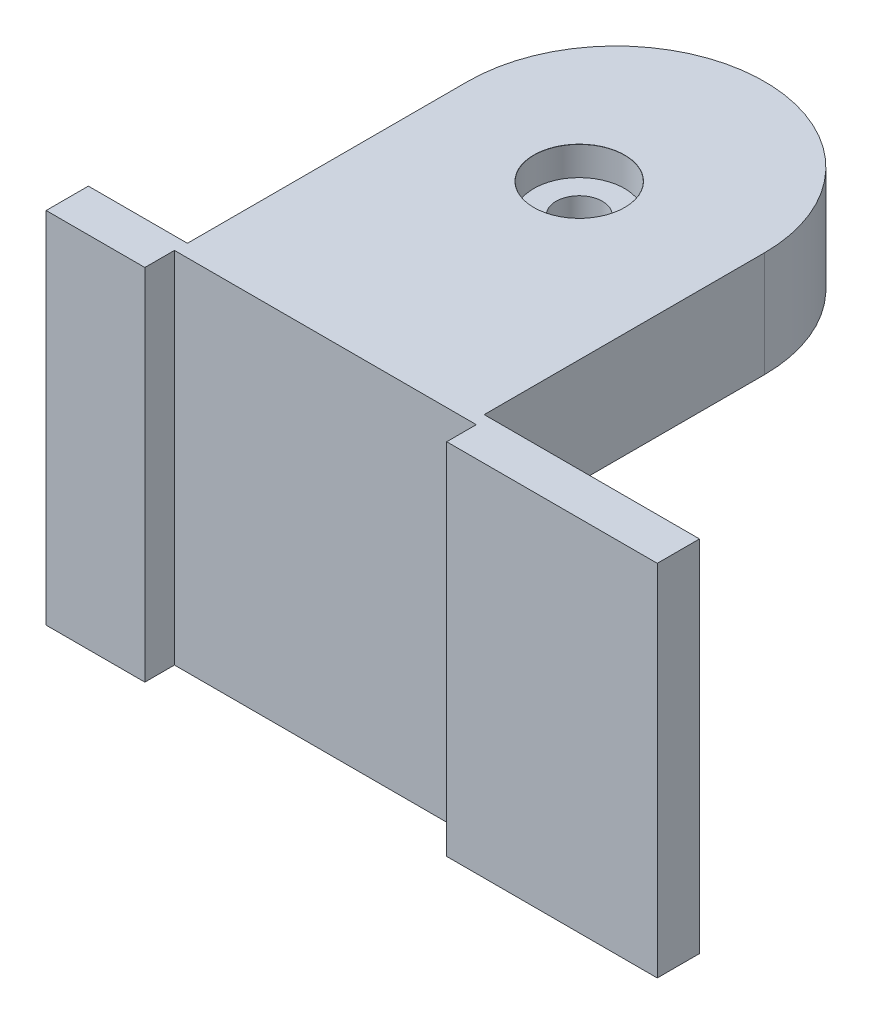
ISO-10303-21;
HEADER;
FILE_DESCRIPTION(('STEP AP214'),'2;1');
FILE_NAME('part.step','',(''),(''),'','','');
FILE_SCHEMA(('AUTOMOTIVE_DESIGN { 1 0 10303 214 1 1 1 1 }'));
ENDSEC;
DATA;
#1=APPLICATION_CONTEXT('core data for automotive mechanical design processes');
#2=APPLICATION_PROTOCOL_DEFINITION('international standard','automotive_design',2000,#1);
#3=PRODUCT_CONTEXT('',#1,'mechanical');
#4=PRODUCT('Part','Part','',(#3));
#5=PRODUCT_RELATED_PRODUCT_CATEGORY('part','',(#4));
#6=PRODUCT_DEFINITION_FORMATION('','',#4);
#7=PRODUCT_DEFINITION_CONTEXT('part definition',#1,'design');
#8=PRODUCT_DEFINITION('design','',#6,#7);
#9=PRODUCT_DEFINITION_SHAPE('','',#8);
#10=(LENGTH_UNIT() NAMED_UNIT(*) SI_UNIT(.MILLI.,.METRE.));
#11=(NAMED_UNIT(*) PLANE_ANGLE_UNIT() SI_UNIT($,.RADIAN.));
#12=(NAMED_UNIT(*) SI_UNIT($,.STERADIAN.) SOLID_ANGLE_UNIT());
#13=UNCERTAINTY_MEASURE_WITH_UNIT(LENGTH_MEASURE(1.E-05),#10,'distance_accuracy_value','');
#14=(GEOMETRIC_REPRESENTATION_CONTEXT(3) GLOBAL_UNCERTAINTY_ASSIGNED_CONTEXT((#13)) GLOBAL_UNIT_ASSIGNED_CONTEXT((#10,
#11,#12)) REPRESENTATION_CONTEXT('',''));
#15=CARTESIAN_POINT('',(0.,0.,0.));
#16=DIRECTION('',(0.,0.,1.));
#17=DIRECTION('',(1.,0.,0.));
#18=AXIS2_PLACEMENT_3D('',#15,#16,#17);
#19=CARTESIAN_POINT('',(0.,0.,4.99999999999997));
#20=DIRECTION('',(0.,0.,1.));
#21=DIRECTION('',(1.,0.,0.));
#22=AXIS2_PLACEMENT_3D('',#19,#20,#21);
#23=PLANE('',#22);
#24=DIRECTION('',(0.,1.,0.));
#25=VECTOR('',#24,1.);
#26=CARTESIAN_POINT('',(-66.2635456404007,-42.3685945886735,4.99999999999997));
#27=LINE('',#26,#25);
#28=CARTESIAN_POINT('',(-66.2635456404007,-42.3685945886735,4.99999999999997));
#29=VERTEX_POINT('',#28);
#30=CARTESIAN_POINT('',(-66.2635456404007,42.6568163205692,4.99999999999997));
#31=VERTEX_POINT('',#30);
#32=EDGE_CURVE('E129',#29,#31,#27,.T.);
#33=ORIENTED_EDGE('',*,*,#32,.T.);
#34=DIRECTION('',(-1.,0.,0.));
#35=VECTOR('',#34,1.);
#36=CARTESIAN_POINT('',(55.0503507920859,42.6568163205692,4.99999999999997));
#37=LINE('',#36,#35);
#38=CARTESIAN_POINT('',(-89.6369586195745,42.6568163205692,4.99999999999997));
#39=VERTEX_POINT('',#38);
#40=EDGE_CURVE('E169',#31,#39,#37,.T.);
#41=ORIENTED_EDGE('',*,*,#40,.T.);
#42=DIRECTION('',(0.,-1.,0.));
#43=VECTOR('',#42,1.);
#44=CARTESIAN_POINT('',(-89.6369586195745,42.6568163205692,4.99999999999997));
#45=LINE('',#44,#43);
#46=CARTESIAN_POINT('',(-89.6369586195745,-42.3685945886735,4.99999999999997));
#47=VERTEX_POINT('',#46);
#48=EDGE_CURVE('E151',#39,#47,#45,.T.);
#49=ORIENTED_EDGE('',*,*,#48,.T.);
#50=DIRECTION('',(-1.,0.,0.));
#51=VECTOR('',#50,1.);
#52=CARTESIAN_POINT('',(55.0503507920859,-42.3685945886735,4.99999999999997));
#53=LINE('',#52,#51);
#54=EDGE_CURVE('E145',#29,#47,#53,.T.);
#55=ORIENTED_EDGE('',*,*,#54,.F.);
#56=EDGE_LOOP('',(#33,#41,#49,#55));
#57=FACE_BOUND('',#56,.T.);
#58=ADVANCED_FACE('F39',(#57),#23,.T.);
#59=CARTESIAN_POINT('',(0.,0.,-4.99999999999997));
#60=DIRECTION('',(0.,0.,1.));
#61=DIRECTION('',(1.,0.,0.));
#62=AXIS2_PLACEMENT_3D('',#59,#60,#61);
#63=PLANE('',#62);
#64=DIRECTION('',(0.,1.,0.));
#65=VECTOR('',#64,1.);
#66=CARTESIAN_POINT('',(-66.1890684352242,17.6568163205692,-4.99999999999997));
#67=LINE('',#66,#65);
#68=CARTESIAN_POINT('',(-66.1890684352242,17.6568163205692,-4.99999999999997));
#69=VERTEX_POINT('',#68);
#70=CARTESIAN_POINT('',(-66.1890684352242,42.6568163205692,-4.99999999999997));
#71=VERTEX_POINT('',#70);
#72=EDGE_CURVE('E184',#69,#71,#67,.T.);
#73=ORIENTED_EDGE('',*,*,#72,.F.);
#74=DIRECTION('',(1.,0.,0.));
#75=VECTOR('',#74,1.);
#76=CARTESIAN_POINT('',(4.07558372386574,17.6568163205692,-4.99999999999998));
#77=LINE('',#76,#75);
#78=CARTESIAN_POINT('',(4.07558372386574,17.6568163205692,-4.99999999999998));
#79=VERTEX_POINT('',#78);
#80=EDGE_CURVE('E223',#69,#79,#77,.T.);
#81=ORIENTED_EDGE('',*,*,#80,.T.);
#82=DIRECTION('',(0.,1.,0.));
#83=VECTOR('',#82,1.);
#84=CARTESIAN_POINT('',(4.07558372386574,17.6568163205692,-4.99999999999998));
#85=LINE('',#84,#83);
#86=CARTESIAN_POINT('',(4.07558372386574,42.6568163205692,-4.99999999999997));
#87=VERTEX_POINT('',#86);
#88=EDGE_CURVE('E165',#79,#87,#85,.T.);
#89=ORIENTED_EDGE('',*,*,#88,.T.);
#90=DIRECTION('',(-1.,0.,0.));
#91=VECTOR('',#90,1.);
#92=CARTESIAN_POINT('',(55.0503507920859,42.6568163205692,-4.99999999999997));
#93=LINE('',#92,#91);
#94=CARTESIAN_POINT('',(55.0503507920859,42.6568163205692,-4.99999999999997));
#95=VERTEX_POINT('',#94);
#96=EDGE_CURVE('E161',#95,#87,#93,.T.);
#97=ORIENTED_EDGE('',*,*,#96,.F.);
#98=DIRECTION('',(0.,-1.,0.));
#99=VECTOR('',#98,1.);
#100=CARTESIAN_POINT('',(55.0503507920859,42.6568163205692,-4.99999999999997));
#101=LINE('',#100,#99);
#102=CARTESIAN_POINT('',(55.0503507920859,-42.3685945886735,-4.99999999999997));
#103=VERTEX_POINT('',#102);
#104=EDGE_CURVE('E155',#95,#103,#101,.T.);
#105=ORIENTED_EDGE('',*,*,#104,.T.);
#106=DIRECTION('',(-1.,0.,0.));
#107=VECTOR('',#106,1.);
#108=CARTESIAN_POINT('',(55.0503507920859,-42.3685945886735,-4.99999999999997));
#109=LINE('',#108,#107);
#110=CARTESIAN_POINT('',(-89.6369586195745,-42.3685945886735,-4.99999999999997));
#111=VERTEX_POINT('',#110);
#112=EDGE_CURVE('E179',#103,#111,#109,.T.);
#113=ORIENTED_EDGE('',*,*,#112,.T.);
#114=DIRECTION('',(0.,-1.,0.));
#115=VECTOR('',#114,1.);
#116=CARTESIAN_POINT('',(-89.6369586195745,42.6568163205692,-4.99999999999997));
#117=LINE('',#116,#115);
#118=CARTESIAN_POINT('',(-89.6369586195745,42.6568163205692,-4.99999999999997));
#119=VERTEX_POINT('',#118);
#120=EDGE_CURVE('E183',#119,#111,#117,.T.);
#121=ORIENTED_EDGE('',*,*,#120,.F.);
#122=EDGE_CURVE('E188',#71,#119,#93,.T.);
#123=ORIENTED_EDGE('',*,*,#122,.F.);
#124=EDGE_LOOP('',(#73,#81,#89,#97,#105,#113,#121,#123));
#125=FACE_BOUND('',#124,.T.);
#126=ADVANCED_FACE('F257',(#125),#63,.F.);
#127=CARTESIAN_POINT('',(55.0503507920859,-42.3685945886735,4.99999999999997));
#128=DIRECTION('',(0.,-1.,0.));
#129=DIRECTION('',(0.,0.,-1.));
#130=AXIS2_PLACEMENT_3D('',#127,#128,#129);
#131=PLANE('',#130);
#132=DIRECTION('',(0.,0.,1.));
#133=VECTOR('',#132,1.);
#134=CARTESIAN_POINT('',(-66.2635456404007,-42.3685945886735,-2.00897527973424));
#135=LINE('',#134,#133);
#136=CARTESIAN_POINT('',(-66.2635456404007,-42.3685945886735,-2.00897527973424));
#137=VERTEX_POINT('',#136);
#138=EDGE_CURVE('E133',#137,#29,#135,.T.);
#139=ORIENTED_EDGE('',*,*,#138,.T.);
#140=ORIENTED_EDGE('',*,*,#54,.T.);
#141=DIRECTION('',(0.,0.,-1.));
#142=VECTOR('',#141,1.);
#143=CARTESIAN_POINT('',(-89.6369586195745,-42.3685945886735,4.99999999999997));
#144=LINE('',#143,#142);
#145=EDGE_CURVE('E178',#47,#111,#144,.T.);
#146=ORIENTED_EDGE('',*,*,#145,.T.);
#147=ORIENTED_EDGE('',*,*,#112,.F.);
#148=DIRECTION('',(0.,0.,-1.));
#149=VECTOR('',#148,1.);
#150=CARTESIAN_POINT('',(55.0503507920859,-42.3685945886735,4.99999999999997));
#151=LINE('',#150,#149);
#152=CARTESIAN_POINT('',(55.0503507920859,-42.3685945886735,4.99999999999997));
#153=VERTEX_POINT('',#152);
#154=EDGE_CURVE('E48',#153,#103,#151,.T.);
#155=ORIENTED_EDGE('',*,*,#154,.F.);
#156=CARTESIAN_POINT('',(5.20020424778214,-42.3685945886735,4.99999999999997));
#157=VERTEX_POINT('',#156);
#158=EDGE_CURVE('E154',#153,#157,#53,.T.);
#159=ORIENTED_EDGE('',*,*,#158,.T.);
#160=DIRECTION('',(0.,0.,-1.));
#161=VECTOR('',#160,1.);
#162=CARTESIAN_POINT('',(5.20020424778214,-42.3685945886735,-2.00897527973424));
#163=LINE('',#162,#161);
#164=CARTESIAN_POINT('',(5.20020424778214,-42.3685945886735,-2.00897527973424));
#165=VERTEX_POINT('',#164);
#166=EDGE_CURVE('E55',#157,#165,#163,.T.);
#167=ORIENTED_EDGE('',*,*,#166,.T.);
#168=DIRECTION('',(-1.,0.,0.));
#169=VECTOR('',#168,1.);
#170=CARTESIAN_POINT('',(-66.2635456404007,-42.3685945886735,-2.00897527973424));
#171=LINE('',#170,#169);
#172=EDGE_CURVE('E142',#165,#137,#171,.T.);
#173=ORIENTED_EDGE('',*,*,#172,.T.);
#174=EDGE_LOOP('',(#139,#140,#146,#147,#155,#159,#167,#173));
#175=FACE_BOUND('',#174,.T.);
#176=ADVANCED_FACE('F41',(#175),#131,.T.);
#177=CARTESIAN_POINT('',(55.0503507920859,42.6568163205692,4.99999999999997));
#178=DIRECTION('',(1.,0.,0.));
#179=DIRECTION('',(0.,0.,-1.));
#180=AXIS2_PLACEMENT_3D('',#177,#178,#179);
#181=PLANE('',#180);
#182=ORIENTED_EDGE('',*,*,#104,.F.);
#183=DIRECTION('',(0.,0.,-1.));
#184=VECTOR('',#183,1.);
#185=CARTESIAN_POINT('',(55.0503507920859,42.6568163205692,4.99999999999997));
#186=LINE('',#185,#184);
#187=CARTESIAN_POINT('',(55.0503507920859,42.6568163205692,4.99999999999997));
#188=VERTEX_POINT('',#187);
#189=EDGE_CURVE('E194',#188,#95,#186,.T.);
#190=ORIENTED_EDGE('',*,*,#189,.F.);
#191=DIRECTION('',(0.,-1.,0.));
#192=VECTOR('',#191,1.);
#193=CARTESIAN_POINT('',(55.0503507920859,42.6568163205692,4.99999999999997));
#194=LINE('',#193,#192);
#195=EDGE_CURVE('E174',#188,#153,#194,.T.);
#196=ORIENTED_EDGE('',*,*,#195,.T.);
#197=ORIENTED_EDGE('',*,*,#154,.T.);
#198=EDGE_LOOP('',(#182,#190,#196,#197));
#199=FACE_BOUND('',#198,.T.);
#200=ADVANCED_FACE('F266',(#199),#181,.T.);
#201=CARTESIAN_POINT('',(55.0503507920859,42.6568163205692,4.99999999999997));
#202=DIRECTION('',(0.,-1.,0.));
#203=DIRECTION('',(0.,0.,-1.));
#204=AXIS2_PLACEMENT_3D('',#201,#202,#203);
#205=PLANE('',#204);
#206=CARTESIAN_POINT('',(-32.5232833981111,42.6568163205692,-64.1004301006144));
#207=DIRECTION('',(0.,1.,0.));
#208=DIRECTION('',(0.,0.,1.));
#209=AXIS2_PLACEMENT_3D('',#206,#207,#208);
#210=CIRCLE('',#209,10.765);
#211=CARTESIAN_POINT('',(-32.5232833981111,42.6568163205692,-53.3354301006145));
#212=VERTEX_POINT('',#211);
#213=EDGE_CURVE('E328',#212,#212,#210,.T.);
#214=ORIENTED_EDGE('',*,*,#213,.F.);
#215=EDGE_LOOP('',(#214));
#216=FACE_BOUND('',#215,.T.);
#217=ORIENTED_EDGE('',*,*,#40,.F.);
#218=DIRECTION('',(0.,0.,-1.));
#219=VECTOR('',#218,1.);
#220=CARTESIAN_POINT('',(-66.2635456404007,42.6568163205692,4.99999999999997));
#221=LINE('',#220,#219);
#222=CARTESIAN_POINT('',(-66.2635456404007,42.6568163205692,-2.00897527973424));
#223=VERTEX_POINT('',#222);
#224=EDGE_CURVE('E136',#31,#223,#221,.T.);
#225=ORIENTED_EDGE('',*,*,#224,.T.);
#226=DIRECTION('',(1.,0.,0.));
#227=VECTOR('',#226,1.);
#228=CARTESIAN_POINT('',(55.0503507920859,42.6568163205692,-2.00897527973424));
#229=LINE('',#228,#227);
#230=CARTESIAN_POINT('',(5.20020424778214,42.6568163205692,-2.00897527973424));
#231=VERTEX_POINT('',#230);
#232=EDGE_CURVE('E11',#223,#231,#229,.T.);
#233=ORIENTED_EDGE('',*,*,#232,.T.);
#234=DIRECTION('',(0.,0.,1.));
#235=VECTOR('',#234,1.);
#236=CARTESIAN_POINT('',(5.20020424778214,42.6568163205692,4.99999999999997));
#237=LINE('',#236,#235);
#238=CARTESIAN_POINT('',(5.20020424778214,42.6568163205692,4.99999999999997));
#239=VERTEX_POINT('',#238);
#240=EDGE_CURVE('E320',#231,#239,#237,.T.);
#241=ORIENTED_EDGE('',*,*,#240,.T.);
#242=EDGE_CURVE('E170',#188,#239,#37,.T.);
#243=ORIENTED_EDGE('',*,*,#242,.F.);
#244=ORIENTED_EDGE('',*,*,#189,.T.);
#245=ORIENTED_EDGE('',*,*,#96,.T.);
#246=DIRECTION('',(0.,0.,-1.));
#247=VECTOR('',#246,1.);
#248=CARTESIAN_POINT('',(4.07558372386574,42.6568163205692,-71.3574931798707));
#249=LINE('',#248,#247);
#250=CARTESIAN_POINT('',(4.07558372386574,42.6568163205692,-71.3574931798707));
#251=VERTEX_POINT('',#250);
#252=EDGE_CURVE('E63',#87,#251,#249,.T.);
#253=ORIENTED_EDGE('',*,*,#252,.T.);
#254=CARTESIAN_POINT('',(-31.0567423556792,42.6568163205692,-71.3574931798707));
#255=DIRECTION('',(0.,1.,0.));
#256=DIRECTION('',(0.,0.,-1.));
#257=AXIS2_PLACEMENT_3D('',#254,#255,#256);
#258=CIRCLE('',#257,35.1323260795449);
#259=CARTESIAN_POINT('',(-66.1890684352242,42.6568163205692,-71.3574931798707));
#260=VERTEX_POINT('',#259);
#261=EDGE_CURVE('E210',#251,#260,#258,.T.);
#262=ORIENTED_EDGE('',*,*,#261,.T.);
#263=DIRECTION('',(0.,0.,1.));
#264=VECTOR('',#263,1.);
#265=CARTESIAN_POINT('',(-66.1890684352242,42.6568163205692,-4.99999999999997));
#266=LINE('',#265,#264);
#267=EDGE_CURVE('E228',#260,#71,#266,.T.);
#268=ORIENTED_EDGE('',*,*,#267,.T.);
#269=ORIENTED_EDGE('',*,*,#122,.T.);
#270=DIRECTION('',(0.,0.,-1.));
#271=VECTOR('',#270,1.);
#272=CARTESIAN_POINT('',(-89.6369586195745,42.6568163205692,4.99999999999997));
#273=LINE('',#272,#271);
#274=EDGE_CURVE('E197',#39,#119,#273,.T.);
#275=ORIENTED_EDGE('',*,*,#274,.F.);
#276=EDGE_LOOP('',(#217,#225,#233,#241,#243,#244,#245,#253,#262,#268,#269,#275));
#277=FACE_BOUND('',#276,.T.);
#278=ADVANCED_FACE('F261',(#216,#277),#205,.F.);
#279=CARTESIAN_POINT('',(-89.6369586195745,42.6568163205692,4.99999999999997));
#280=DIRECTION('',(1.,0.,0.));
#281=DIRECTION('',(0.,0.,-1.));
#282=AXIS2_PLACEMENT_3D('',#279,#280,#281);
#283=PLANE('',#282);
#284=ORIENTED_EDGE('',*,*,#120,.T.);
#285=ORIENTED_EDGE('',*,*,#145,.F.);
#286=ORIENTED_EDGE('',*,*,#48,.F.);
#287=ORIENTED_EDGE('',*,*,#274,.T.);
#288=EDGE_LOOP('',(#284,#285,#286,#287));
#289=FACE_BOUND('',#288,.T.);
#290=ADVANCED_FACE('F272',(#289),#283,.F.);
#291=DIRECTION('',(0.,1.,0.));
#292=VECTOR('',#291,1.);
#293=CARTESIAN_POINT('',(5.20020424778214,-42.3685945886735,4.99999999999997));
#294=LINE('',#293,#292);
#295=EDGE_CURVE('E141',#157,#239,#294,.T.);
#296=ORIENTED_EDGE('',*,*,#295,.F.);
#297=ORIENTED_EDGE('',*,*,#158,.F.);
#298=ORIENTED_EDGE('',*,*,#195,.F.);
#299=ORIENTED_EDGE('',*,*,#242,.T.);
#300=EDGE_LOOP('',(#296,#297,#298,#299));
#301=FACE_BOUND('',#300,.T.);
#302=ADVANCED_FACE('F297',(#301),#23,.T.);
#303=CARTESIAN_POINT('',(-66.1890684352242,17.6568163205692,-4.99999999999997));
#304=DIRECTION('',(-1.,0.,0.));
#305=DIRECTION('',(0.,0.,1.));
#306=AXIS2_PLACEMENT_3D('',#303,#304,#305);
#307=PLANE('',#306);
#308=ORIENTED_EDGE('',*,*,#267,.F.);
#309=DIRECTION('',(0.,1.,0.));
#310=VECTOR('',#309,1.);
#311=CARTESIAN_POINT('',(-66.1890684352242,17.6568163205692,-71.3574931798707));
#312=LINE('',#311,#310);
#313=CARTESIAN_POINT('',(-66.1890684352242,17.6568163205692,-71.3574931798707));
#314=VERTEX_POINT('',#313);
#315=EDGE_CURVE('E248',#314,#260,#312,.T.);
#316=ORIENTED_EDGE('',*,*,#315,.F.);
#317=DIRECTION('',(0.,0.,1.));
#318=VECTOR('',#317,1.);
#319=CARTESIAN_POINT('',(-66.1890684352242,17.6568163205692,-4.99999999999997));
#320=LINE('',#319,#318);
#321=EDGE_CURVE('E236',#314,#69,#320,.T.);
#322=ORIENTED_EDGE('',*,*,#321,.T.);
#323=ORIENTED_EDGE('',*,*,#72,.T.);
#324=EDGE_LOOP('',(#308,#316,#322,#323));
#325=FACE_BOUND('',#324,.T.);
#326=ADVANCED_FACE('F277',(#325),#307,.T.);
#327=CARTESIAN_POINT('',(-31.0567423556792,17.6568163205692,-71.3574931798707));
#328=DIRECTION('',(0.,1.,0.));
#329=DIRECTION('',(0.,0.,1.));
#330=AXIS2_PLACEMENT_3D('',#327,#328,#329);
#331=CYLINDRICAL_SURFACE('',#330,35.1323260795449);
#332=ORIENTED_EDGE('',*,*,#261,.F.);
#333=DIRECTION('',(0.,1.,0.));
#334=VECTOR('',#333,1.);
#335=CARTESIAN_POINT('',(4.07558372386574,17.6568163205692,-71.3574931798707));
#336=LINE('',#335,#334);
#337=CARTESIAN_POINT('',(4.07558372386574,17.6568163205692,-71.3574931798707));
#338=VERTEX_POINT('',#337);
#339=EDGE_CURVE('E250',#338,#251,#336,.T.);
#340=ORIENTED_EDGE('',*,*,#339,.F.);
#341=CARTESIAN_POINT('',(-31.0567423556792,17.6568163205692,-71.3574931798707));
#342=DIRECTION('',(0.,1.,0.));
#343=DIRECTION('',(0.,0.,-1.));
#344=AXIS2_PLACEMENT_3D('',#341,#342,#343);
#345=CIRCLE('',#344,35.1323260795449);
#346=EDGE_CURVE('E232',#338,#314,#345,.T.);
#347=ORIENTED_EDGE('',*,*,#346,.T.);
#348=ORIENTED_EDGE('',*,*,#315,.T.);
#349=EDGE_LOOP('',(#332,#340,#347,#348));
#350=FACE_BOUND('',#349,.T.);
#351=ADVANCED_FACE('F284',(#350),#331,.T.);
#352=CARTESIAN_POINT('',(4.07558372386574,17.6568163205692,-71.3574931798707));
#353=DIRECTION('',(1.,0.,0.));
#354=DIRECTION('',(0.,0.,-1.));
#355=AXIS2_PLACEMENT_3D('',#352,#353,#354);
#356=PLANE('',#355);
#357=ORIENTED_EDGE('',*,*,#252,.F.);
#358=ORIENTED_EDGE('',*,*,#88,.F.);
#359=DIRECTION('',(0.,0.,-1.));
#360=VECTOR('',#359,1.);
#361=CARTESIAN_POINT('',(4.07558372386574,17.6568163205692,-71.3574931798707));
#362=LINE('',#361,#360);
#363=EDGE_CURVE('E227',#79,#338,#362,.T.);
#364=ORIENTED_EDGE('',*,*,#363,.T.);
#365=ORIENTED_EDGE('',*,*,#339,.T.);
#366=EDGE_LOOP('',(#357,#358,#364,#365));
#367=FACE_BOUND('',#366,.T.);
#368=ADVANCED_FACE('F282',(#367),#356,.T.);
#369=CARTESIAN_POINT('',(-31.0567423556792,17.6568163205692,-71.3574931798707));
#370=DIRECTION('',(0.,-1.,0.));
#371=DIRECTION('',(0.,0.,-1.));
#372=AXIS2_PLACEMENT_3D('',#369,#370,#371);
#373=PLANE('',#372);
#374=CARTESIAN_POINT('',(-32.5232833981111,17.6568163205692,-64.1004301006144));
#375=DIRECTION('',(0.,-1.,0.));
#376=DIRECTION('',(0.,0.,-1.));
#377=AXIS2_PLACEMENT_3D('',#374,#375,#376);
#378=CIRCLE('',#377,5.49999999999999);
#379=CARTESIAN_POINT('',(-32.5232833981111,17.6568163205692,-69.6004301006144));
#380=VERTEX_POINT('',#379);
#381=EDGE_CURVE('E202',#380,#380,#378,.T.);
#382=ORIENTED_EDGE('',*,*,#381,.F.);
#383=EDGE_LOOP('',(#382));
#384=FACE_BOUND('',#383,.T.);
#385=ORIENTED_EDGE('',*,*,#80,.F.);
#386=ORIENTED_EDGE('',*,*,#321,.F.);
#387=ORIENTED_EDGE('',*,*,#346,.F.);
#388=ORIENTED_EDGE('',*,*,#363,.F.);
#389=EDGE_LOOP('',(#385,#386,#387,#388));
#390=FACE_BOUND('',#389,.T.);
#391=ADVANCED_FACE('F281',(#384,#390),#373,.T.);
#392=CARTESIAN_POINT('',(-32.5232833981111,42.6568163205692,-64.1004301006144));
#393=DIRECTION('',(0.,1.,0.));
#394=DIRECTION('',(0.,0.,1.));
#395=AXIS2_PLACEMENT_3D('',#392,#393,#394);
#396=CYLINDRICAL_SURFACE('',#395,5.49999999999999);
#397=ORIENTED_EDGE('',*,*,#381,.T.);
#398=EDGE_LOOP('',(#397));
#399=FACE_BOUND('',#398,.T.);
#400=CARTESIAN_POINT('',(-32.5232833981111,35.8068163205692,-64.1004301006144));
#401=DIRECTION('',(0.,1.,0.));
#402=DIRECTION('',(0.,0.,1.));
#403=AXIS2_PLACEMENT_3D('',#400,#401,#402);
#404=CIRCLE('',#403,5.5);
#405=CARTESIAN_POINT('',(-32.5232833981111,35.8068163205692,-58.6004301006144));
#406=VERTEX_POINT('',#405);
#407=EDGE_CURVE('E205',#406,#406,#404,.T.);
#408=ORIENTED_EDGE('',*,*,#407,.T.);
#409=EDGE_LOOP('',(#408));
#410=FACE_BOUND('',#409,.T.);
#411=ADVANCED_FACE('F290',(#399,#410),#396,.F.);
#412=CARTESIAN_POINT('',(-21.7832833981111,35.8068163205692,-64.1004301006144));
#413=DIRECTION('',(0.,-1.,0.));
#414=DIRECTION('',(0.,0.,-1.));
#415=AXIS2_PLACEMENT_3D('',#412,#413,#414);
#416=PLANE('',#415);
#417=ORIENTED_EDGE('',*,*,#407,.F.);
#418=EDGE_LOOP('',(#417));
#419=FACE_BOUND('',#418,.T.);
#420=CARTESIAN_POINT('',(-32.5232833981111,35.8068163205692,-64.1004301006144));
#421=DIRECTION('',(0.,1.,0.));
#422=DIRECTION('',(0.,0.,1.));
#423=AXIS2_PLACEMENT_3D('',#420,#421,#422);
#424=CIRCLE('',#423,10.74);
#425=CARTESIAN_POINT('',(-32.5232833981111,35.8068163205692,-53.3604301006145));
#426=VERTEX_POINT('',#425);
#427=EDGE_CURVE('E213',#426,#426,#424,.T.);
#428=ORIENTED_EDGE('',*,*,#427,.T.);
#429=EDGE_LOOP('',(#428));
#430=FACE_BOUND('',#429,.T.);
#431=ADVANCED_FACE('F395',(#419,#430),#416,.F.);
#432=CARTESIAN_POINT('',(-32.5232833981111,42.6568163205692,-64.1004301006144));
#433=DIRECTION('',(0.,1.,0.));
#434=DIRECTION('',(0.,0.,1.));
#435=AXIS2_PLACEMENT_3D('',#432,#433,#434);
#436=CYLINDRICAL_SURFACE('',#435,10.74);
#437=ORIENTED_EDGE('',*,*,#427,.F.);
#438=EDGE_LOOP('',(#437));
#439=FACE_BOUND('',#438,.T.);
#440=CARTESIAN_POINT('',(-32.5232833981111,42.6318163205692,-64.1004301006144));
#441=DIRECTION('',(0.,1.,0.));
#442=DIRECTION('',(0.,0.,1.));
#443=AXIS2_PLACEMENT_3D('',#440,#441,#442);
#444=CIRCLE('',#443,10.74);
#445=CARTESIAN_POINT('',(-32.5232833981111,42.6318163205692,-53.3604301006144));
#446=VERTEX_POINT('',#445);
#447=EDGE_CURVE('E219',#446,#446,#444,.T.);
#448=ORIENTED_EDGE('',*,*,#447,.T.);
#449=EDGE_LOOP('',(#448));
#450=FACE_BOUND('',#449,.T.);
#451=ADVANCED_FACE('F335',(#439,#450),#436,.F.);
#452=CARTESIAN_POINT('',(-32.5232833981111,42.6568163205692,-64.1004301006144));
#453=DIRECTION('',(0.,1.,0.));
#454=DIRECTION('',(0.,0.,1.));
#455=AXIS2_PLACEMENT_3D('',#452,#453,#454);
#456=CONICAL_SURFACE('',#455,10.765,0.785398163397379);
#457=ORIENTED_EDGE('',*,*,#447,.F.);
#458=EDGE_LOOP('',(#457));
#459=FACE_BOUND('',#458,.T.);
#460=ORIENTED_EDGE('',*,*,#213,.T.);
#461=EDGE_LOOP('',(#460));
#462=FACE_BOUND('',#461,.T.);
#463=ADVANCED_FACE('F337',(#459,#462),#456,.F.);
#464=CARTESIAN_POINT('',(-66.2635456404007,-42.3685945886735,-2.00897527973424));
#465=DIRECTION('',(0.,0.,-1.));
#466=DIRECTION('',(-1.,0.,0.));
#467=AXIS2_PLACEMENT_3D('',#464,#465,#466);
#468=PLANE('',#467);
#469=DIRECTION('',(0.,1.,0.));
#470=VECTOR('',#469,1.);
#471=CARTESIAN_POINT('',(-66.2635456404007,-42.3685945886735,-2.00897527973424));
#472=LINE('',#471,#470);
#473=EDGE_CURVE('E317',#137,#223,#472,.T.);
#474=ORIENTED_EDGE('',*,*,#473,.F.);
#475=ORIENTED_EDGE('',*,*,#172,.F.);
#476=DIRECTION('',(0.,1.,0.));
#477=VECTOR('',#476,1.);
#478=CARTESIAN_POINT('',(5.20020424778214,-42.3685945886735,-2.00897527973424));
#479=LINE('',#478,#477);
#480=EDGE_CURVE('E310',#165,#231,#479,.T.);
#481=ORIENTED_EDGE('',*,*,#480,.T.);
#482=ORIENTED_EDGE('',*,*,#232,.F.);
#483=EDGE_LOOP('',(#474,#475,#481,#482));
#484=FACE_BOUND('',#483,.T.);
#485=ADVANCED_FACE('F340',(#484),#468,.F.);
#486=CARTESIAN_POINT('',(-66.2635456404007,-42.3685945886735,-2.00897527973424));
#487=DIRECTION('',(-1.,0.,0.));
#488=DIRECTION('',(0.,0.,1.));
#489=AXIS2_PLACEMENT_3D('',#486,#487,#488);
#490=PLANE('',#489);
#491=ORIENTED_EDGE('',*,*,#32,.F.);
#492=ORIENTED_EDGE('',*,*,#138,.F.);
#493=ORIENTED_EDGE('',*,*,#473,.T.);
#494=ORIENTED_EDGE('',*,*,#224,.F.);
#495=EDGE_LOOP('',(#491,#492,#493,#494));
#496=FACE_BOUND('',#495,.T.);
#497=ADVANCED_FACE('F131',(#496),#490,.F.);
#498=CARTESIAN_POINT('',(5.20020424778214,-42.3685945886735,-2.00897527973424));
#499=DIRECTION('',(1.,0.,0.));
#500=DIRECTION('',(0.,0.,-1.));
#501=AXIS2_PLACEMENT_3D('',#498,#499,#500);
#502=PLANE('',#501);
#503=ORIENTED_EDGE('',*,*,#480,.F.);
#504=ORIENTED_EDGE('',*,*,#166,.F.);
#505=ORIENTED_EDGE('',*,*,#295,.T.);
#506=ORIENTED_EDGE('',*,*,#240,.F.);
#507=EDGE_LOOP('',(#503,#504,#505,#506));
#508=FACE_BOUND('',#507,.T.);
#509=ADVANCED_FACE('F441',(#508),#502,.F.);
#510=CLOSED_SHELL('',(#58,#126,#176,#200,#278,#290,#302,#326,#351,#368,#391,#411,#431,#451,#463,
#485,#497,#509));
#511=MANIFOLD_SOLID_BREP('B2',#510);
#512=ADVANCED_BREP_SHAPE_REPRESENTATION('',(#18,#511),#14);
#513=SHAPE_DEFINITION_REPRESENTATION(#9,#512);
ENDSEC;
END-ISO-10303-21;
